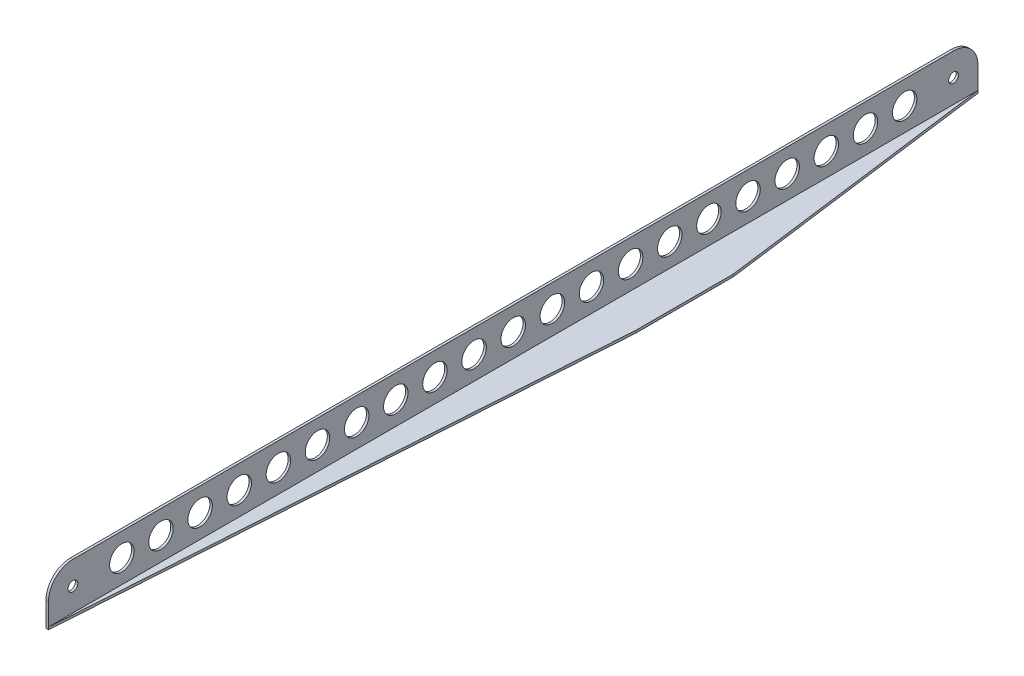
ISO-10303-21;
HEADER;
FILE_DESCRIPTION(('STEP AP214'),'2;1');
FILE_NAME('part.step','',(''),(''),'','','');
FILE_SCHEMA(('AUTOMOTIVE_DESIGN { 1 0 10303 214 1 1 1 1 }'));
ENDSEC;
DATA;
#1=APPLICATION_CONTEXT('core data for automotive mechanical design processes');
#2=APPLICATION_PROTOCOL_DEFINITION('international standard','automotive_design',2000,#1);
#3=PRODUCT_CONTEXT('',#1,'mechanical');
#4=PRODUCT('Part','Part','',(#3));
#5=PRODUCT_RELATED_PRODUCT_CATEGORY('part','',(#4));
#6=PRODUCT_DEFINITION_FORMATION('','',#4);
#7=PRODUCT_DEFINITION_CONTEXT('part definition',#1,'design');
#8=PRODUCT_DEFINITION('design','',#6,#7);
#9=PRODUCT_DEFINITION_SHAPE('','',#8);
#10=(LENGTH_UNIT() NAMED_UNIT(*) SI_UNIT(.MILLI.,.METRE.));
#11=(NAMED_UNIT(*) PLANE_ANGLE_UNIT() SI_UNIT($,.RADIAN.));
#12=(NAMED_UNIT(*) SI_UNIT($,.STERADIAN.) SOLID_ANGLE_UNIT());
#13=UNCERTAINTY_MEASURE_WITH_UNIT(LENGTH_MEASURE(1.E-05),#10,'distance_accuracy_value','');
#14=(GEOMETRIC_REPRESENTATION_CONTEXT(3) GLOBAL_UNCERTAINTY_ASSIGNED_CONTEXT((#13)) GLOBAL_UNIT_ASSIGNED_CONTEXT((#10,
#11,#12)) REPRESENTATION_CONTEXT('',''));
#15=CARTESIAN_POINT('',(0.,0.,0.));
#16=DIRECTION('',(0.,0.,1.));
#17=DIRECTION('',(1.,0.,0.));
#18=AXIS2_PLACEMENT_3D('',#15,#16,#17);
#19=CARTESIAN_POINT('',(-9.,-24.8880108190066,30.));
#20=DIRECTION('',(1.,0.,0.));
#21=DIRECTION('',(0.,1.,0.));
#22=AXIS2_PLACEMENT_3D('',#19,#20,#21);
#23=CYLINDRICAL_SURFACE('',#22,4.99999999999999);
#24=CARTESIAN_POINT('',(1.,-24.8880108190066,30.));
#25=DIRECTION('',(1.,0.,0.));
#26=DIRECTION('',(0.,1.,0.));
#27=AXIS2_PLACEMENT_3D('',#24,#25,#26);
#28=CIRCLE('',#27,4.99999999999999);
#29=CARTESIAN_POINT('',(1.,-19.8880108190066,30.));
#30=VERTEX_POINT('',#29);
#31=EDGE_CURVE('E264',#30,#30,#28,.T.);
#32=ORIENTED_EDGE('',*,*,#31,.T.);
#33=EDGE_LOOP('',(#32));
#34=FACE_BOUND('',#33,.T.);
#35=CARTESIAN_POINT('',(0.,-24.8880108190066,30.));
#36=DIRECTION('',(1.,0.,0.));
#37=DIRECTION('',(0.,1.,0.));
#38=AXIS2_PLACEMENT_3D('',#35,#36,#37);
#39=CIRCLE('',#38,4.99999999999999);
#40=CARTESIAN_POINT('',(0.,-19.8880108190066,30.));
#41=VERTEX_POINT('',#40);
#42=EDGE_CURVE('E267',#41,#41,#39,.T.);
#43=ORIENTED_EDGE('',*,*,#42,.F.);
#44=EDGE_LOOP('',(#43));
#45=FACE_BOUND('',#44,.T.);
#46=ADVANCED_FACE('F33',(#34,#45),#23,.F.);
#47=CARTESIAN_POINT('',(-9.,-24.8880108190066,46.));
#48=DIRECTION('',(1.,0.,0.));
#49=DIRECTION('',(0.,1.,0.));
#50=AXIS2_PLACEMENT_3D('',#47,#48,#49);
#51=CYLINDRICAL_SURFACE('',#50,4.99999999999999);
#52=CARTESIAN_POINT('',(1.,-24.8880108190066,46.));
#53=DIRECTION('',(1.,0.,0.));
#54=DIRECTION('',(0.,1.,0.));
#55=AXIS2_PLACEMENT_3D('',#52,#53,#54);
#56=CIRCLE('',#55,4.99999999999999);
#57=CARTESIAN_POINT('',(1.,-19.8880108190066,46.));
#58=VERTEX_POINT('',#57);
#59=EDGE_CURVE('E258',#58,#58,#56,.T.);
#60=ORIENTED_EDGE('',*,*,#59,.T.);
#61=EDGE_LOOP('',(#60));
#62=FACE_BOUND('',#61,.T.);
#63=CARTESIAN_POINT('',(0.,-24.8880108190066,46.));
#64=DIRECTION('',(1.,0.,0.));
#65=DIRECTION('',(0.,1.,0.));
#66=AXIS2_PLACEMENT_3D('',#63,#64,#65);
#67=CIRCLE('',#66,4.99999999999999);
#68=CARTESIAN_POINT('',(0.,-19.8880108190066,46.));
#69=VERTEX_POINT('',#68);
#70=EDGE_CURVE('E261',#69,#69,#67,.T.);
#71=ORIENTED_EDGE('',*,*,#70,.F.);
#72=EDGE_LOOP('',(#71));
#73=FACE_BOUND('',#72,.T.);
#74=ADVANCED_FACE('F367',(#62,#73),#51,.F.);
#75=CARTESIAN_POINT('',(-9.,-24.8880108190066,61.9999999999999));
#76=DIRECTION('',(1.,0.,0.));
#77=DIRECTION('',(0.,1.,0.));
#78=AXIS2_PLACEMENT_3D('',#75,#76,#77);
#79=CYLINDRICAL_SURFACE('',#78,4.99999999999999);
#80=CARTESIAN_POINT('',(1.,-24.8880108190066,61.9999999999999));
#81=DIRECTION('',(1.,0.,0.));
#82=DIRECTION('',(0.,1.,0.));
#83=AXIS2_PLACEMENT_3D('',#80,#81,#82);
#84=CIRCLE('',#83,4.99999999999999);
#85=CARTESIAN_POINT('',(1.,-19.8880108190066,61.9999999999999));
#86=VERTEX_POINT('',#85);
#87=EDGE_CURVE('E252',#86,#86,#84,.T.);
#88=ORIENTED_EDGE('',*,*,#87,.T.);
#89=EDGE_LOOP('',(#88));
#90=FACE_BOUND('',#89,.T.);
#91=CARTESIAN_POINT('',(0.,-24.8880108190066,61.9999999999999));
#92=DIRECTION('',(1.,0.,0.));
#93=DIRECTION('',(0.,1.,0.));
#94=AXIS2_PLACEMENT_3D('',#91,#92,#93);
#95=CIRCLE('',#94,4.99999999999999);
#96=CARTESIAN_POINT('',(0.,-19.8880108190066,61.9999999999999));
#97=VERTEX_POINT('',#96);
#98=EDGE_CURVE('E255',#97,#97,#95,.T.);
#99=ORIENTED_EDGE('',*,*,#98,.F.);
#100=EDGE_LOOP('',(#99));
#101=FACE_BOUND('',#100,.T.);
#102=ADVANCED_FACE('F374',(#90,#101),#79,.F.);
#103=CARTESIAN_POINT('',(-9.,-24.8880108190066,78.));
#104=DIRECTION('',(1.,0.,0.));
#105=DIRECTION('',(0.,1.,0.));
#106=AXIS2_PLACEMENT_3D('',#103,#104,#105);
#107=CYLINDRICAL_SURFACE('',#106,4.99999999999999);
#108=CARTESIAN_POINT('',(1.,-24.8880108190066,78.));
#109=DIRECTION('',(1.,0.,0.));
#110=DIRECTION('',(0.,1.,0.));
#111=AXIS2_PLACEMENT_3D('',#108,#109,#110);
#112=CIRCLE('',#111,4.99999999999999);
#113=CARTESIAN_POINT('',(1.,-19.8880108190066,78.));
#114=VERTEX_POINT('',#113);
#115=EDGE_CURVE('E246',#114,#114,#112,.T.);
#116=ORIENTED_EDGE('',*,*,#115,.T.);
#117=EDGE_LOOP('',(#116));
#118=FACE_BOUND('',#117,.T.);
#119=CARTESIAN_POINT('',(0.,-24.8880108190066,78.));
#120=DIRECTION('',(1.,0.,0.));
#121=DIRECTION('',(0.,1.,0.));
#122=AXIS2_PLACEMENT_3D('',#119,#120,#121);
#123=CIRCLE('',#122,4.99999999999999);
#124=CARTESIAN_POINT('',(0.,-19.8880108190066,78.));
#125=VERTEX_POINT('',#124);
#126=EDGE_CURVE('E249',#125,#125,#123,.T.);
#127=ORIENTED_EDGE('',*,*,#126,.F.);
#128=EDGE_LOOP('',(#127));
#129=FACE_BOUND('',#128,.T.);
#130=ADVANCED_FACE('F460',(#118,#129),#107,.F.);
#131=CARTESIAN_POINT('',(-9.,-24.8880108190066,94.));
#132=DIRECTION('',(1.,0.,0.));
#133=DIRECTION('',(0.,1.,0.));
#134=AXIS2_PLACEMENT_3D('',#131,#132,#133);
#135=CYLINDRICAL_SURFACE('',#134,4.99999999999999);
#136=CARTESIAN_POINT('',(1.,-24.8880108190066,94.));
#137=DIRECTION('',(1.,0.,0.));
#138=DIRECTION('',(0.,1.,0.));
#139=AXIS2_PLACEMENT_3D('',#136,#137,#138);
#140=CIRCLE('',#139,4.99999999999999);
#141=CARTESIAN_POINT('',(1.,-19.8880108190066,94.));
#142=VERTEX_POINT('',#141);
#143=EDGE_CURVE('E240',#142,#142,#140,.T.);
#144=ORIENTED_EDGE('',*,*,#143,.T.);
#145=EDGE_LOOP('',(#144));
#146=FACE_BOUND('',#145,.T.);
#147=CARTESIAN_POINT('',(0.,-24.8880108190066,94.));
#148=DIRECTION('',(1.,0.,0.));
#149=DIRECTION('',(0.,1.,0.));
#150=AXIS2_PLACEMENT_3D('',#147,#148,#149);
#151=CIRCLE('',#150,4.99999999999999);
#152=CARTESIAN_POINT('',(0.,-19.8880108190066,94.));
#153=VERTEX_POINT('',#152);
#154=EDGE_CURVE('E243',#153,#153,#151,.T.);
#155=ORIENTED_EDGE('',*,*,#154,.F.);
#156=EDGE_LOOP('',(#155));
#157=FACE_BOUND('',#156,.T.);
#158=ADVANCED_FACE('F469',(#146,#157),#135,.F.);
#159=CARTESIAN_POINT('',(-9.,-24.8880108190066,110.));
#160=DIRECTION('',(1.,0.,0.));
#161=DIRECTION('',(0.,1.,0.));
#162=AXIS2_PLACEMENT_3D('',#159,#160,#161);
#163=CYLINDRICAL_SURFACE('',#162,4.99999999999999);
#164=CARTESIAN_POINT('',(1.,-24.8880108190066,110.));
#165=DIRECTION('',(1.,0.,0.));
#166=DIRECTION('',(0.,1.,0.));
#167=AXIS2_PLACEMENT_3D('',#164,#165,#166);
#168=CIRCLE('',#167,4.99999999999999);
#169=CARTESIAN_POINT('',(1.,-19.8880108190066,110.));
#170=VERTEX_POINT('',#169);
#171=EDGE_CURVE('E234',#170,#170,#168,.T.);
#172=ORIENTED_EDGE('',*,*,#171,.T.);
#173=EDGE_LOOP('',(#172));
#174=FACE_BOUND('',#173,.T.);
#175=CARTESIAN_POINT('',(0.,-24.8880108190066,110.));
#176=DIRECTION('',(1.,0.,0.));
#177=DIRECTION('',(0.,1.,0.));
#178=AXIS2_PLACEMENT_3D('',#175,#176,#177);
#179=CIRCLE('',#178,4.99999999999999);
#180=CARTESIAN_POINT('',(0.,-19.8880108190066,110.));
#181=VERTEX_POINT('',#180);
#182=EDGE_CURVE('E237',#181,#181,#179,.T.);
#183=ORIENTED_EDGE('',*,*,#182,.F.);
#184=EDGE_LOOP('',(#183));
#185=FACE_BOUND('',#184,.T.);
#186=ADVANCED_FACE('F479',(#174,#185),#163,.F.);
#187=CARTESIAN_POINT('',(-9.,-24.8880108190066,126.));
#188=DIRECTION('',(1.,0.,0.));
#189=DIRECTION('',(0.,1.,0.));
#190=AXIS2_PLACEMENT_3D('',#187,#188,#189);
#191=CYLINDRICAL_SURFACE('',#190,4.99999999999999);
#192=CARTESIAN_POINT('',(1.,-24.8880108190066,126.));
#193=DIRECTION('',(1.,0.,0.));
#194=DIRECTION('',(0.,1.,0.));
#195=AXIS2_PLACEMENT_3D('',#192,#193,#194);
#196=CIRCLE('',#195,4.99999999999999);
#197=CARTESIAN_POINT('',(1.,-19.8880108190066,126.));
#198=VERTEX_POINT('',#197);
#199=EDGE_CURVE('E228',#198,#198,#196,.T.);
#200=ORIENTED_EDGE('',*,*,#199,.T.);
#201=EDGE_LOOP('',(#200));
#202=FACE_BOUND('',#201,.T.);
#203=CARTESIAN_POINT('',(0.,-24.8880108190066,126.));
#204=DIRECTION('',(1.,0.,0.));
#205=DIRECTION('',(0.,1.,0.));
#206=AXIS2_PLACEMENT_3D('',#203,#204,#205);
#207=CIRCLE('',#206,4.99999999999999);
#208=CARTESIAN_POINT('',(0.,-19.8880108190066,126.));
#209=VERTEX_POINT('',#208);
#210=EDGE_CURVE('E231',#209,#209,#207,.T.);
#211=ORIENTED_EDGE('',*,*,#210,.F.);
#212=EDGE_LOOP('',(#211));
#213=FACE_BOUND('',#212,.T.);
#214=ADVANCED_FACE('F489',(#202,#213),#191,.F.);
#215=CARTESIAN_POINT('',(-9.,-24.8880108190066,142.));
#216=DIRECTION('',(1.,0.,0.));
#217=DIRECTION('',(0.,1.,0.));
#218=AXIS2_PLACEMENT_3D('',#215,#216,#217);
#219=CYLINDRICAL_SURFACE('',#218,4.99999999999999);
#220=CARTESIAN_POINT('',(1.,-24.8880108190066,142.));
#221=DIRECTION('',(1.,0.,0.));
#222=DIRECTION('',(0.,1.,0.));
#223=AXIS2_PLACEMENT_3D('',#220,#221,#222);
#224=CIRCLE('',#223,4.99999999999999);
#225=CARTESIAN_POINT('',(1.,-19.8880108190066,142.));
#226=VERTEX_POINT('',#225);
#227=EDGE_CURVE('E222',#226,#226,#224,.T.);
#228=ORIENTED_EDGE('',*,*,#227,.T.);
#229=EDGE_LOOP('',(#228));
#230=FACE_BOUND('',#229,.T.);
#231=CARTESIAN_POINT('',(0.,-24.8880108190066,142.));
#232=DIRECTION('',(1.,0.,0.));
#233=DIRECTION('',(0.,1.,0.));
#234=AXIS2_PLACEMENT_3D('',#231,#232,#233);
#235=CIRCLE('',#234,4.99999999999999);
#236=CARTESIAN_POINT('',(0.,-19.8880108190066,142.));
#237=VERTEX_POINT('',#236);
#238=EDGE_CURVE('E225',#237,#237,#235,.T.);
#239=ORIENTED_EDGE('',*,*,#238,.F.);
#240=EDGE_LOOP('',(#239));
#241=FACE_BOUND('',#240,.T.);
#242=ADVANCED_FACE('F499',(#230,#241),#219,.F.);
#243=CARTESIAN_POINT('',(-9.,-24.8880108190066,158.));
#244=DIRECTION('',(1.,0.,0.));
#245=DIRECTION('',(0.,1.,0.));
#246=AXIS2_PLACEMENT_3D('',#243,#244,#245);
#247=CYLINDRICAL_SURFACE('',#246,4.99999999999999);
#248=CARTESIAN_POINT('',(1.,-24.8880108190066,158.));
#249=DIRECTION('',(1.,0.,0.));
#250=DIRECTION('',(0.,1.,0.));
#251=AXIS2_PLACEMENT_3D('',#248,#249,#250);
#252=CIRCLE('',#251,4.99999999999999);
#253=CARTESIAN_POINT('',(1.,-19.8880108190066,158.));
#254=VERTEX_POINT('',#253);
#255=EDGE_CURVE('E216',#254,#254,#252,.T.);
#256=ORIENTED_EDGE('',*,*,#255,.T.);
#257=EDGE_LOOP('',(#256));
#258=FACE_BOUND('',#257,.T.);
#259=CARTESIAN_POINT('',(0.,-24.8880108190066,158.));
#260=DIRECTION('',(1.,0.,0.));
#261=DIRECTION('',(0.,1.,0.));
#262=AXIS2_PLACEMENT_3D('',#259,#260,#261);
#263=CIRCLE('',#262,4.99999999999999);
#264=CARTESIAN_POINT('',(0.,-19.8880108190066,158.));
#265=VERTEX_POINT('',#264);
#266=EDGE_CURVE('E219',#265,#265,#263,.T.);
#267=ORIENTED_EDGE('',*,*,#266,.F.);
#268=EDGE_LOOP('',(#267));
#269=FACE_BOUND('',#268,.T.);
#270=ADVANCED_FACE('F509',(#258,#269),#247,.F.);
#271=CARTESIAN_POINT('',(-9.,-24.8880108190066,174.));
#272=DIRECTION('',(1.,0.,0.));
#273=DIRECTION('',(0.,1.,0.));
#274=AXIS2_PLACEMENT_3D('',#271,#272,#273);
#275=CYLINDRICAL_SURFACE('',#274,4.99999999999999);
#276=CARTESIAN_POINT('',(1.,-24.8880108190066,174.));
#277=DIRECTION('',(1.,0.,0.));
#278=DIRECTION('',(0.,1.,0.));
#279=AXIS2_PLACEMENT_3D('',#276,#277,#278);
#280=CIRCLE('',#279,4.99999999999999);
#281=CARTESIAN_POINT('',(1.,-19.8880108190066,174.));
#282=VERTEX_POINT('',#281);
#283=EDGE_CURVE('E210',#282,#282,#280,.T.);
#284=ORIENTED_EDGE('',*,*,#283,.T.);
#285=EDGE_LOOP('',(#284));
#286=FACE_BOUND('',#285,.T.);
#287=CARTESIAN_POINT('',(0.,-24.8880108190066,174.));
#288=DIRECTION('',(1.,0.,0.));
#289=DIRECTION('',(0.,1.,0.));
#290=AXIS2_PLACEMENT_3D('',#287,#288,#289);
#291=CIRCLE('',#290,4.99999999999999);
#292=CARTESIAN_POINT('',(0.,-19.8880108190066,174.));
#293=VERTEX_POINT('',#292);
#294=EDGE_CURVE('E213',#293,#293,#291,.T.);
#295=ORIENTED_EDGE('',*,*,#294,.F.);
#296=EDGE_LOOP('',(#295));
#297=FACE_BOUND('',#296,.T.);
#298=ADVANCED_FACE('F519',(#286,#297),#275,.F.);
#299=CARTESIAN_POINT('',(-9.,-24.8880108190066,190.));
#300=DIRECTION('',(1.,0.,0.));
#301=DIRECTION('',(0.,1.,0.));
#302=AXIS2_PLACEMENT_3D('',#299,#300,#301);
#303=CYLINDRICAL_SURFACE('',#302,4.99999999999999);
#304=CARTESIAN_POINT('',(1.,-24.8880108190066,190.));
#305=DIRECTION('',(1.,0.,0.));
#306=DIRECTION('',(0.,1.,0.));
#307=AXIS2_PLACEMENT_3D('',#304,#305,#306);
#308=CIRCLE('',#307,4.99999999999999);
#309=CARTESIAN_POINT('',(1.,-19.8880108190066,190.));
#310=VERTEX_POINT('',#309);
#311=EDGE_CURVE('E204',#310,#310,#308,.T.);
#312=ORIENTED_EDGE('',*,*,#311,.T.);
#313=EDGE_LOOP('',(#312));
#314=FACE_BOUND('',#313,.T.);
#315=CARTESIAN_POINT('',(0.,-24.8880108190066,190.));
#316=DIRECTION('',(1.,0.,0.));
#317=DIRECTION('',(0.,1.,0.));
#318=AXIS2_PLACEMENT_3D('',#315,#316,#317);
#319=CIRCLE('',#318,4.99999999999999);
#320=CARTESIAN_POINT('',(0.,-19.8880108190066,190.));
#321=VERTEX_POINT('',#320);
#322=EDGE_CURVE('E207',#321,#321,#319,.T.);
#323=ORIENTED_EDGE('',*,*,#322,.F.);
#324=EDGE_LOOP('',(#323));
#325=FACE_BOUND('',#324,.T.);
#326=ADVANCED_FACE('F529',(#314,#325),#303,.F.);
#327=CARTESIAN_POINT('',(-9.,-24.8880108190066,206.));
#328=DIRECTION('',(1.,0.,0.));
#329=DIRECTION('',(0.,1.,0.));
#330=AXIS2_PLACEMENT_3D('',#327,#328,#329);
#331=CYLINDRICAL_SURFACE('',#330,4.99999999999999);
#332=CARTESIAN_POINT('',(1.,-24.8880108190066,206.));
#333=DIRECTION('',(1.,0.,0.));
#334=DIRECTION('',(0.,1.,0.));
#335=AXIS2_PLACEMENT_3D('',#332,#333,#334);
#336=CIRCLE('',#335,4.99999999999999);
#337=CARTESIAN_POINT('',(1.,-19.8880108190066,206.));
#338=VERTEX_POINT('',#337);
#339=EDGE_CURVE('E198',#338,#338,#336,.T.);
#340=ORIENTED_EDGE('',*,*,#339,.T.);
#341=EDGE_LOOP('',(#340));
#342=FACE_BOUND('',#341,.T.);
#343=CARTESIAN_POINT('',(0.,-24.8880108190066,206.));
#344=DIRECTION('',(1.,0.,0.));
#345=DIRECTION('',(0.,1.,0.));
#346=AXIS2_PLACEMENT_3D('',#343,#344,#345);
#347=CIRCLE('',#346,4.99999999999999);
#348=CARTESIAN_POINT('',(0.,-19.8880108190066,206.));
#349=VERTEX_POINT('',#348);
#350=EDGE_CURVE('E201',#349,#349,#347,.T.);
#351=ORIENTED_EDGE('',*,*,#350,.F.);
#352=EDGE_LOOP('',(#351));
#353=FACE_BOUND('',#352,.T.);
#354=ADVANCED_FACE('F539',(#342,#353),#331,.F.);
#355=CARTESIAN_POINT('',(-9.,-24.8880108190066,222.));
#356=DIRECTION('',(1.,0.,0.));
#357=DIRECTION('',(0.,1.,0.));
#358=AXIS2_PLACEMENT_3D('',#355,#356,#357);
#359=CYLINDRICAL_SURFACE('',#358,4.99999999999999);
#360=CARTESIAN_POINT('',(1.,-24.8880108190066,222.));
#361=DIRECTION('',(1.,0.,0.));
#362=DIRECTION('',(0.,1.,0.));
#363=AXIS2_PLACEMENT_3D('',#360,#361,#362);
#364=CIRCLE('',#363,4.99999999999999);
#365=CARTESIAN_POINT('',(1.,-19.8880108190066,222.));
#366=VERTEX_POINT('',#365);
#367=EDGE_CURVE('E192',#366,#366,#364,.T.);
#368=ORIENTED_EDGE('',*,*,#367,.T.);
#369=EDGE_LOOP('',(#368));
#370=FACE_BOUND('',#369,.T.);
#371=CARTESIAN_POINT('',(0.,-24.8880108190066,222.));
#372=DIRECTION('',(1.,0.,0.));
#373=DIRECTION('',(0.,1.,0.));
#374=AXIS2_PLACEMENT_3D('',#371,#372,#373);
#375=CIRCLE('',#374,4.99999999999999);
#376=CARTESIAN_POINT('',(0.,-19.8880108190066,222.));
#377=VERTEX_POINT('',#376);
#378=EDGE_CURVE('E195',#377,#377,#375,.T.);
#379=ORIENTED_EDGE('',*,*,#378,.F.);
#380=EDGE_LOOP('',(#379));
#381=FACE_BOUND('',#380,.T.);
#382=ADVANCED_FACE('F549',(#370,#381),#359,.F.);
#383=CARTESIAN_POINT('',(-9.,-24.8880108190066,238.));
#384=DIRECTION('',(1.,0.,0.));
#385=DIRECTION('',(0.,1.,0.));
#386=AXIS2_PLACEMENT_3D('',#383,#384,#385);
#387=CYLINDRICAL_SURFACE('',#386,4.99999999999999);
#388=CARTESIAN_POINT('',(1.,-24.8880108190066,238.));
#389=DIRECTION('',(1.,0.,0.));
#390=DIRECTION('',(0.,1.,0.));
#391=AXIS2_PLACEMENT_3D('',#388,#389,#390);
#392=CIRCLE('',#391,4.99999999999999);
#393=CARTESIAN_POINT('',(1.,-19.8880108190066,238.));
#394=VERTEX_POINT('',#393);
#395=EDGE_CURVE('E186',#394,#394,#392,.T.);
#396=ORIENTED_EDGE('',*,*,#395,.T.);
#397=EDGE_LOOP('',(#396));
#398=FACE_BOUND('',#397,.T.);
#399=CARTESIAN_POINT('',(0.,-24.8880108190066,238.));
#400=DIRECTION('',(1.,0.,0.));
#401=DIRECTION('',(0.,1.,0.));
#402=AXIS2_PLACEMENT_3D('',#399,#400,#401);
#403=CIRCLE('',#402,4.99999999999999);
#404=CARTESIAN_POINT('',(0.,-19.8880108190066,238.));
#405=VERTEX_POINT('',#404);
#406=EDGE_CURVE('E189',#405,#405,#403,.T.);
#407=ORIENTED_EDGE('',*,*,#406,.F.);
#408=EDGE_LOOP('',(#407));
#409=FACE_BOUND('',#408,.T.);
#410=ADVANCED_FACE('F559',(#398,#409),#387,.F.);
#411=CARTESIAN_POINT('',(-9.,-24.8880108190066,254.));
#412=DIRECTION('',(1.,0.,0.));
#413=DIRECTION('',(0.,1.,0.));
#414=AXIS2_PLACEMENT_3D('',#411,#412,#413);
#415=CYLINDRICAL_SURFACE('',#414,4.99999999999999);
#416=CARTESIAN_POINT('',(1.,-24.8880108190066,254.));
#417=DIRECTION('',(1.,0.,0.));
#418=DIRECTION('',(0.,1.,0.));
#419=AXIS2_PLACEMENT_3D('',#416,#417,#418);
#420=CIRCLE('',#419,4.99999999999999);
#421=CARTESIAN_POINT('',(1.,-19.8880108190066,254.));
#422=VERTEX_POINT('',#421);
#423=EDGE_CURVE('E180',#422,#422,#420,.T.);
#424=ORIENTED_EDGE('',*,*,#423,.T.);
#425=EDGE_LOOP('',(#424));
#426=FACE_BOUND('',#425,.T.);
#427=CARTESIAN_POINT('',(0.,-24.8880108190066,254.));
#428=DIRECTION('',(1.,0.,0.));
#429=DIRECTION('',(0.,1.,0.));
#430=AXIS2_PLACEMENT_3D('',#427,#428,#429);
#431=CIRCLE('',#430,4.99999999999999);
#432=CARTESIAN_POINT('',(0.,-19.8880108190066,254.));
#433=VERTEX_POINT('',#432);
#434=EDGE_CURVE('E183',#433,#433,#431,.T.);
#435=ORIENTED_EDGE('',*,*,#434,.F.);
#436=EDGE_LOOP('',(#435));
#437=FACE_BOUND('',#436,.T.);
#438=ADVANCED_FACE('F569',(#426,#437),#415,.F.);
#439=CARTESIAN_POINT('',(-9.,-24.8880108190066,270.));
#440=DIRECTION('',(1.,0.,0.));
#441=DIRECTION('',(0.,1.,0.));
#442=AXIS2_PLACEMENT_3D('',#439,#440,#441);
#443=CYLINDRICAL_SURFACE('',#442,4.99999999999999);
#444=CARTESIAN_POINT('',(1.,-24.8880108190066,270.));
#445=DIRECTION('',(1.,0.,0.));
#446=DIRECTION('',(0.,1.,0.));
#447=AXIS2_PLACEMENT_3D('',#444,#445,#446);
#448=CIRCLE('',#447,4.99999999999999);
#449=CARTESIAN_POINT('',(1.,-19.8880108190066,270.));
#450=VERTEX_POINT('',#449);
#451=EDGE_CURVE('E174',#450,#450,#448,.T.);
#452=ORIENTED_EDGE('',*,*,#451,.T.);
#453=EDGE_LOOP('',(#452));
#454=FACE_BOUND('',#453,.T.);
#455=CARTESIAN_POINT('',(0.,-24.8880108190066,270.));
#456=DIRECTION('',(1.,0.,0.));
#457=DIRECTION('',(0.,1.,0.));
#458=AXIS2_PLACEMENT_3D('',#455,#456,#457);
#459=CIRCLE('',#458,4.99999999999999);
#460=CARTESIAN_POINT('',(0.,-19.8880108190066,270.));
#461=VERTEX_POINT('',#460);
#462=EDGE_CURVE('E177',#461,#461,#459,.T.);
#463=ORIENTED_EDGE('',*,*,#462,.F.);
#464=EDGE_LOOP('',(#463));
#465=FACE_BOUND('',#464,.T.);
#466=ADVANCED_FACE('F579',(#454,#465),#443,.F.);
#467=CARTESIAN_POINT('',(-9.,-24.8880108190066,286.));
#468=DIRECTION('',(1.,0.,0.));
#469=DIRECTION('',(0.,1.,0.));
#470=AXIS2_PLACEMENT_3D('',#467,#468,#469);
#471=CYLINDRICAL_SURFACE('',#470,4.99999999999999);
#472=CARTESIAN_POINT('',(1.,-24.8880108190066,286.));
#473=DIRECTION('',(1.,0.,0.));
#474=DIRECTION('',(0.,1.,0.));
#475=AXIS2_PLACEMENT_3D('',#472,#473,#474);
#476=CIRCLE('',#475,4.99999999999999);
#477=CARTESIAN_POINT('',(1.,-19.8880108190066,286.));
#478=VERTEX_POINT('',#477);
#479=EDGE_CURVE('E168',#478,#478,#476,.T.);
#480=ORIENTED_EDGE('',*,*,#479,.T.);
#481=EDGE_LOOP('',(#480));
#482=FACE_BOUND('',#481,.T.);
#483=CARTESIAN_POINT('',(0.,-24.8880108190066,286.));
#484=DIRECTION('',(1.,0.,0.));
#485=DIRECTION('',(0.,1.,0.));
#486=AXIS2_PLACEMENT_3D('',#483,#484,#485);
#487=CIRCLE('',#486,4.99999999999999);
#488=CARTESIAN_POINT('',(0.,-19.8880108190066,286.));
#489=VERTEX_POINT('',#488);
#490=EDGE_CURVE('E171',#489,#489,#487,.T.);
#491=ORIENTED_EDGE('',*,*,#490,.F.);
#492=EDGE_LOOP('',(#491));
#493=FACE_BOUND('',#492,.T.);
#494=ADVANCED_FACE('F589',(#482,#493),#471,.F.);
#495=CARTESIAN_POINT('',(-9.,-24.8880108190066,302.));
#496=DIRECTION('',(1.,0.,0.));
#497=DIRECTION('',(0.,1.,0.));
#498=AXIS2_PLACEMENT_3D('',#495,#496,#497);
#499=CYLINDRICAL_SURFACE('',#498,4.99999999999999);
#500=CARTESIAN_POINT('',(1.,-24.8880108190066,302.));
#501=DIRECTION('',(1.,0.,0.));
#502=DIRECTION('',(0.,1.,0.));
#503=AXIS2_PLACEMENT_3D('',#500,#501,#502);
#504=CIRCLE('',#503,4.99999999999999);
#505=CARTESIAN_POINT('',(1.,-19.8880108190066,302.));
#506=VERTEX_POINT('',#505);
#507=EDGE_CURVE('E162',#506,#506,#504,.T.);
#508=ORIENTED_EDGE('',*,*,#507,.T.);
#509=EDGE_LOOP('',(#508));
#510=FACE_BOUND('',#509,.T.);
#511=CARTESIAN_POINT('',(0.,-24.8880108190066,302.));
#512=DIRECTION('',(1.,0.,0.));
#513=DIRECTION('',(0.,1.,0.));
#514=AXIS2_PLACEMENT_3D('',#511,#512,#513);
#515=CIRCLE('',#514,4.99999999999999);
#516=CARTESIAN_POINT('',(0.,-19.8880108190066,302.));
#517=VERTEX_POINT('',#516);
#518=EDGE_CURVE('E165',#517,#517,#515,.T.);
#519=ORIENTED_EDGE('',*,*,#518,.F.);
#520=EDGE_LOOP('',(#519));
#521=FACE_BOUND('',#520,.T.);
#522=ADVANCED_FACE('F599',(#510,#521),#499,.F.);
#523=CARTESIAN_POINT('',(-9.,-24.8880108190066,318.));
#524=DIRECTION('',(1.,0.,0.));
#525=DIRECTION('',(0.,1.,0.));
#526=AXIS2_PLACEMENT_3D('',#523,#524,#525);
#527=CYLINDRICAL_SURFACE('',#526,4.99999999999999);
#528=CARTESIAN_POINT('',(1.,-24.8880108190066,318.));
#529=DIRECTION('',(1.,0.,0.));
#530=DIRECTION('',(0.,1.,0.));
#531=AXIS2_PLACEMENT_3D('',#528,#529,#530);
#532=CIRCLE('',#531,4.99999999999999);
#533=CARTESIAN_POINT('',(1.,-19.8880108190066,318.));
#534=VERTEX_POINT('',#533);
#535=EDGE_CURVE('E156',#534,#534,#532,.T.);
#536=ORIENTED_EDGE('',*,*,#535,.T.);
#537=EDGE_LOOP('',(#536));
#538=FACE_BOUND('',#537,.T.);
#539=CARTESIAN_POINT('',(0.,-24.8880108190066,318.));
#540=DIRECTION('',(1.,0.,0.));
#541=DIRECTION('',(0.,1.,0.));
#542=AXIS2_PLACEMENT_3D('',#539,#540,#541);
#543=CIRCLE('',#542,4.99999999999999);
#544=CARTESIAN_POINT('',(0.,-19.8880108190066,318.));
#545=VERTEX_POINT('',#544);
#546=EDGE_CURVE('E159',#545,#545,#543,.T.);
#547=ORIENTED_EDGE('',*,*,#546,.F.);
#548=EDGE_LOOP('',(#547));
#549=FACE_BOUND('',#548,.T.);
#550=ADVANCED_FACE('F363',(#538,#549),#527,.F.);
#551=CARTESIAN_POINT('',(1.,-15.3880108190066,380.));
#552=DIRECTION('',(0.,-1.,0.));
#553=DIRECTION('',(0.,0.,-1.));
#554=AXIS2_PLACEMENT_3D('',#551,#552,#553);
#555=PLANE('',#554);
#556=DIRECTION('',(0.,0.,-1.));
#557=VECTOR('',#556,1.);
#558=CARTESIAN_POINT('',(1.,-15.3880108190066,380.));
#559=LINE('',#558,#557);
#560=CARTESIAN_POINT('',(1.,-15.3880108190066,370.));
#561=VERTEX_POINT('',#560);
#562=CARTESIAN_POINT('',(1.,-15.3880108190066,10.));
#563=VERTEX_POINT('',#562);
#564=EDGE_CURVE('E137',#561,#563,#559,.T.);
#565=ORIENTED_EDGE('',*,*,#564,.T.);
#566=DIRECTION('',(-1.,0.,0.));
#567=VECTOR('',#566,1.);
#568=CARTESIAN_POINT('',(1.,-15.3880108190066,10.));
#569=LINE('',#568,#567);
#570=CARTESIAN_POINT('',(0.,-15.3880108190066,10.));
#571=VERTEX_POINT('',#570);
#572=EDGE_CURVE('E272',#563,#571,#569,.T.);
#573=ORIENTED_EDGE('',*,*,#572,.T.);
#574=DIRECTION('',(0.,0.,-1.));
#575=VECTOR('',#574,1.);
#576=CARTESIAN_POINT('',(0.,-15.3880108190066,380.));
#577=LINE('',#576,#575);
#578=CARTESIAN_POINT('',(0.,-15.3880108190066,370.));
#579=VERTEX_POINT('',#578);
#580=EDGE_CURVE('E119',#579,#571,#577,.T.);
#581=ORIENTED_EDGE('',*,*,#580,.F.);
#582=DIRECTION('',(-1.,0.,0.));
#583=VECTOR('',#582,1.);
#584=CARTESIAN_POINT('',(1.,-15.3880108190066,370.));
#585=LINE('',#584,#583);
#586=EDGE_CURVE('E270',#579,#561,#585,.F.);
#587=ORIENTED_EDGE('',*,*,#586,.T.);
#588=EDGE_LOOP('',(#565,#573,#581,#587));
#589=FACE_BOUND('',#588,.T.);
#590=ADVANCED_FACE('F283',(#589),#555,.F.);
#591=CARTESIAN_POINT('',(0.,-15.3880108190066,380.));
#592=DIRECTION('',(1.,0.,0.));
#593=DIRECTION('',(0.,1.,0.));
#594=AXIS2_PLACEMENT_3D('',#591,#592,#593);
#595=PLANE('',#594);
#596=CARTESIAN_POINT('',(0.,-24.8880108190066,334.));
#597=DIRECTION('',(1.,0.,0.));
#598=DIRECTION('',(0.,1.,0.));
#599=AXIS2_PLACEMENT_3D('',#596,#597,#598);
#600=CIRCLE('',#599,4.99999999999999);
#601=CARTESIAN_POINT('',(0.,-19.8880108190066,334.));
#602=VERTEX_POINT('',#601);
#603=EDGE_CURVE('E326',#602,#602,#600,.T.);
#604=ORIENTED_EDGE('',*,*,#603,.T.);
#605=EDGE_LOOP('',(#604));
#606=FACE_BOUND('',#605,.T.);
#607=CARTESIAN_POINT('',(0.,-24.8880108190066,350.));
#608=DIRECTION('',(1.,0.,0.));
#609=DIRECTION('',(0.,1.,0.));
#610=AXIS2_PLACEMENT_3D('',#607,#608,#609);
#611=CIRCLE('',#610,4.99999999999999);
#612=CARTESIAN_POINT('',(0.,-19.8880108190066,350.));
#613=VERTEX_POINT('',#612);
#614=EDGE_CURVE('E129',#613,#613,#611,.T.);
#615=ORIENTED_EDGE('',*,*,#614,.T.);
#616=EDGE_LOOP('',(#615));
#617=FACE_BOUND('',#616,.T.);
#618=CARTESIAN_POINT('',(0.,-24.8880108190066,10.));
#619=DIRECTION('',(1.,0.,0.));
#620=DIRECTION('',(0.,1.,0.));
#621=AXIS2_PLACEMENT_3D('',#618,#619,#620);
#622=CIRCLE('',#621,2.);
#623=CARTESIAN_POINT('',(0.,-22.8880108190066,10.));
#624=VERTEX_POINT('',#623);
#625=EDGE_CURVE('E291',#624,#624,#622,.T.);
#626=ORIENTED_EDGE('',*,*,#625,.T.);
#627=EDGE_LOOP('',(#626));
#628=FACE_BOUND('',#627,.T.);
#629=CARTESIAN_POINT('',(0.,-24.8880108190066,370.));
#630=DIRECTION('',(1.,0.,0.));
#631=DIRECTION('',(0.,1.,0.));
#632=AXIS2_PLACEMENT_3D('',#629,#630,#631);
#633=CIRCLE('',#632,2.);
#634=CARTESIAN_POINT('',(0.,-22.8880108190066,370.));
#635=VERTEX_POINT('',#634);
#636=EDGE_CURVE('E293',#635,#635,#633,.T.);
#637=ORIENTED_EDGE('',*,*,#636,.T.);
#638=EDGE_LOOP('',(#637));
#639=FACE_BOUND('',#638,.T.);
#640=ORIENTED_EDGE('',*,*,#580,.T.);
#641=CARTESIAN_POINT('',(0.,-25.3880108190066,10.));
#642=DIRECTION('',(1.,0.,0.));
#643=DIRECTION('',(0.,1.,0.));
#644=AXIS2_PLACEMENT_3D('',#641,#642,#643);
#645=CIRCLE('',#644,10.);
#646=CARTESIAN_POINT('',(0.,-25.3880108190066,0.));
#647=VERTEX_POINT('',#646);
#648=EDGE_CURVE('E277',#571,#647,#645,.F.);
#649=ORIENTED_EDGE('',*,*,#648,.T.);
#650=DIRECTION('',(0.,-1.,0.));
#651=VECTOR('',#650,1.);
#652=CARTESIAN_POINT('',(0.,-15.3880108190066,0.));
#653=LINE('',#652,#651);
#654=CARTESIAN_POINT('',(0.,-35.3880108190066,0.));
#655=VERTEX_POINT('',#654);
#656=EDGE_CURVE('E145',#647,#655,#653,.T.);
#657=ORIENTED_EDGE('',*,*,#656,.T.);
#658=DIRECTION('',(0.,0.,-1.));
#659=VECTOR('',#658,1.);
#660=CARTESIAN_POINT('',(0.,-35.3880108190066,380.));
#661=LINE('',#660,#659);
#662=CARTESIAN_POINT('',(0.,-35.3880108190066,380.));
#663=VERTEX_POINT('',#662);
#664=EDGE_CURVE('E136',#663,#655,#661,.T.);
#665=ORIENTED_EDGE('',*,*,#664,.F.);
#666=DIRECTION('',(0.,-1.,0.));
#667=VECTOR('',#666,1.);
#668=CARTESIAN_POINT('',(0.,-15.3880108190066,380.));
#669=LINE('',#668,#667);
#670=CARTESIAN_POINT('',(0.,-25.3880108190066,380.));
#671=VERTEX_POINT('',#670);
#672=EDGE_CURVE('E140',#671,#663,#669,.T.);
#673=ORIENTED_EDGE('',*,*,#672,.F.);
#674=CARTESIAN_POINT('',(0.,-25.3880108190066,370.));
#675=DIRECTION('',(1.,0.,0.));
#676=DIRECTION('',(0.,1.,0.));
#677=AXIS2_PLACEMENT_3D('',#674,#675,#676);
#678=CIRCLE('',#677,10.);
#679=EDGE_CURVE('E275',#671,#579,#678,.F.);
#680=ORIENTED_EDGE('',*,*,#679,.T.);
#681=EDGE_LOOP('',(#640,#649,#657,#665,#673,#680));
#682=FACE_BOUND('',#681,.T.);
#683=ORIENTED_EDGE('',*,*,#546,.T.);
#684=EDGE_LOOP('',(#683));
#685=FACE_BOUND('',#684,.T.);
#686=ORIENTED_EDGE('',*,*,#518,.T.);
#687=EDGE_LOOP('',(#686));
#688=FACE_BOUND('',#687,.T.);
#689=ORIENTED_EDGE('',*,*,#490,.T.);
#690=EDGE_LOOP('',(#689));
#691=FACE_BOUND('',#690,.T.);
#692=ORIENTED_EDGE('',*,*,#462,.T.);
#693=EDGE_LOOP('',(#692));
#694=FACE_BOUND('',#693,.T.);
#695=ORIENTED_EDGE('',*,*,#434,.T.);
#696=EDGE_LOOP('',(#695));
#697=FACE_BOUND('',#696,.T.);
#698=ORIENTED_EDGE('',*,*,#406,.T.);
#699=EDGE_LOOP('',(#698));
#700=FACE_BOUND('',#699,.T.);
#701=ORIENTED_EDGE('',*,*,#378,.T.);
#702=EDGE_LOOP('',(#701));
#703=FACE_BOUND('',#702,.T.);
#704=ORIENTED_EDGE('',*,*,#350,.T.);
#705=EDGE_LOOP('',(#704));
#706=FACE_BOUND('',#705,.T.);
#707=ORIENTED_EDGE('',*,*,#322,.T.);
#708=EDGE_LOOP('',(#707));
#709=FACE_BOUND('',#708,.T.);
#710=ORIENTED_EDGE('',*,*,#294,.T.);
#711=EDGE_LOOP('',(#710));
#712=FACE_BOUND('',#711,.T.);
#713=ORIENTED_EDGE('',*,*,#266,.T.);
#714=EDGE_LOOP('',(#713));
#715=FACE_BOUND('',#714,.T.);
#716=ORIENTED_EDGE('',*,*,#238,.T.);
#717=EDGE_LOOP('',(#716));
#718=FACE_BOUND('',#717,.T.);
#719=ORIENTED_EDGE('',*,*,#210,.T.);
#720=EDGE_LOOP('',(#719));
#721=FACE_BOUND('',#720,.T.);
#722=ORIENTED_EDGE('',*,*,#182,.T.);
#723=EDGE_LOOP('',(#722));
#724=FACE_BOUND('',#723,.T.);
#725=ORIENTED_EDGE('',*,*,#154,.T.);
#726=EDGE_LOOP('',(#725));
#727=FACE_BOUND('',#726,.T.);
#728=ORIENTED_EDGE('',*,*,#126,.T.);
#729=EDGE_LOOP('',(#728));
#730=FACE_BOUND('',#729,.T.);
#731=ORIENTED_EDGE('',*,*,#98,.T.);
#732=EDGE_LOOP('',(#731));
#733=FACE_BOUND('',#732,.T.);
#734=ORIENTED_EDGE('',*,*,#70,.T.);
#735=EDGE_LOOP('',(#734));
#736=FACE_BOUND('',#735,.T.);
#737=ORIENTED_EDGE('',*,*,#42,.T.);
#738=EDGE_LOOP('',(#737));
#739=FACE_BOUND('',#738,.T.);
#740=ADVANCED_FACE('F288',(#606,#617,#628,#639,#682,#685,#688,#691,#694,#697,#700,#703,#706,
#709,#712,#715,#718,#721,#724,#727,#730,#733,#736,#739),#595,.F.);
#741=CARTESIAN_POINT('',(0.,-35.3880108190066,380.));
#742=DIRECTION('',(0.,1.,0.));
#743=DIRECTION('',(0.,0.,1.));
#744=AXIS2_PLACEMENT_3D('',#741,#742,#743);
#745=PLANE('',#744);
#746=DIRECTION('',(0.,0.,1.));
#747=VECTOR('',#746,1.);
#748=CARTESIAN_POINT('',(16.,-35.3880108190066,380.));
#749=LINE('',#748,#747);
#750=CARTESIAN_POINT('',(16.,-35.3880108190066,115.));
#751=VERTEX_POINT('',#750);
#752=CARTESIAN_POINT('',(16.,-35.3880108190066,155.));
#753=VERTEX_POINT('',#752);
#754=EDGE_CURVE('E305',#751,#753,#749,.T.);
#755=ORIENTED_EDGE('',*,*,#754,.T.);
#756=DIRECTION('',(-0.066519010523774,0.,0.997785157856609));
#757=VECTOR('',#756,1.);
#758=CARTESIAN_POINT('',(0.995575221238938,-35.3880108190066,380.066371681416));
#759=LINE('',#758,#757);
#760=CARTESIAN_POINT('',(1.,-35.3880108190066,380.));
#761=VERTEX_POINT('',#760);
#762=EDGE_CURVE('E310',#753,#761,#759,.T.);
#763=ORIENTED_EDGE('',*,*,#762,.T.);
#764=DIRECTION('',(1.,0.,0.));
#765=VECTOR('',#764,1.);
#766=CARTESIAN_POINT('',(0.,-35.3880108190066,380.));
#767=LINE('',#766,#765);
#768=EDGE_CURVE('E143',#663,#761,#767,.T.);
#769=ORIENTED_EDGE('',*,*,#768,.F.);
#770=ORIENTED_EDGE('',*,*,#664,.T.);
#771=DIRECTION('',(1.,0.,0.));
#772=VECTOR('',#771,1.);
#773=CARTESIAN_POINT('',(0.,-35.3880108190066,0.));
#774=LINE('',#773,#772);
#775=CARTESIAN_POINT('',(1.,-35.3880108190066,0.));
#776=VERTEX_POINT('',#775);
#777=EDGE_CURVE('E141',#655,#776,#774,.T.);
#778=ORIENTED_EDGE('',*,*,#777,.T.);
#779=DIRECTION('',(0.129339184067768,0.,0.991600411186222));
#780=VECTOR('',#779,1.);
#781=CARTESIAN_POINT('',(49.7193308550186,-35.3880108190066,373.514869888476));
#782=LINE('',#781,#780);
#783=EDGE_CURVE('E115',#776,#751,#782,.T.);
#784=ORIENTED_EDGE('',*,*,#783,.T.);
#785=EDGE_LOOP('',(#755,#763,#769,#770,#778,#784));
#786=FACE_BOUND('',#785,.T.);
#787=ADVANCED_FACE('F354',(#786),#745,.F.);
#788=CARTESIAN_POINT('',(20.,-34.3880108190066,380.));
#789=DIRECTION('',(0.,-1.,0.));
#790=DIRECTION('',(0.,0.,-1.));
#791=AXIS2_PLACEMENT_3D('',#788,#789,#790);
#792=PLANE('',#791);
#793=DIRECTION('',(0.,0.,-1.));
#794=VECTOR('',#793,1.);
#795=CARTESIAN_POINT('',(1.,-34.3880108190066,380.));
#796=LINE('',#795,#794);
#797=CARTESIAN_POINT('',(1.,-34.3880108190066,380.));
#798=VERTEX_POINT('',#797);
#799=CARTESIAN_POINT('',(1.,-34.3880108190066,0.));
#800=VERTEX_POINT('',#799);
#801=EDGE_CURVE('E126',#798,#800,#796,.T.);
#802=ORIENTED_EDGE('',*,*,#801,.F.);
#803=DIRECTION('',(-0.066519010523774,0.,0.997785157856609));
#804=VECTOR('',#803,1.);
#805=CARTESIAN_POINT('',(16.,-34.3880108190066,155.));
#806=LINE('',#805,#804);
#807=CARTESIAN_POINT('',(16.,-34.3880108190066,155.));
#808=VERTEX_POINT('',#807);
#809=EDGE_CURVE('E317',#808,#798,#806,.T.);
#810=ORIENTED_EDGE('',*,*,#809,.F.);
#811=DIRECTION('',(0.,0.,1.));
#812=VECTOR('',#811,1.);
#813=CARTESIAN_POINT('',(16.,-34.3880108190066,115.));
#814=LINE('',#813,#812);
#815=CARTESIAN_POINT('',(16.,-34.3880108190066,115.));
#816=VERTEX_POINT('',#815);
#817=EDGE_CURVE('E128',#816,#808,#814,.T.);
#818=ORIENTED_EDGE('',*,*,#817,.F.);
#819=DIRECTION('',(0.129339184067768,0.,0.991600411186222));
#820=VECTOR('',#819,1.);
#821=CARTESIAN_POINT('',(1.,-34.3880108190066,0.));
#822=LINE('',#821,#820);
#823=EDGE_CURVE('E112',#800,#816,#822,.T.);
#824=ORIENTED_EDGE('',*,*,#823,.F.);
#825=EDGE_LOOP('',(#802,#810,#818,#824));
#826=FACE_BOUND('',#825,.T.);
#827=ADVANCED_FACE('F124',(#826),#792,.F.);
#828=CARTESIAN_POINT('',(1.,-34.3880108190066,380.));
#829=DIRECTION('',(-1.,0.,0.));
#830=DIRECTION('',(0.,-1.,0.));
#831=AXIS2_PLACEMENT_3D('',#828,#829,#830);
#832=PLANE('',#831);
#833=CARTESIAN_POINT('',(1.,-24.8880108190066,334.));
#834=DIRECTION('',(1.,0.,0.));
#835=DIRECTION('',(0.,1.,0.));
#836=AXIS2_PLACEMENT_3D('',#833,#834,#835);
#837=CIRCLE('',#836,4.99999999999999);
#838=CARTESIAN_POINT('',(1.,-19.8880108190066,334.));
#839=VERTEX_POINT('',#838);
#840=EDGE_CURVE('E329',#839,#839,#837,.T.);
#841=ORIENTED_EDGE('',*,*,#840,.F.);
#842=EDGE_LOOP('',(#841));
#843=FACE_BOUND('',#842,.T.);
#844=CARTESIAN_POINT('',(1.,-24.8880108190066,350.));
#845=DIRECTION('',(1.,0.,0.));
#846=DIRECTION('',(0.,1.,0.));
#847=AXIS2_PLACEMENT_3D('',#844,#845,#846);
#848=CIRCLE('',#847,4.99999999999999);
#849=CARTESIAN_POINT('',(1.,-19.8880108190066,350.));
#850=VERTEX_POINT('',#849);
#851=EDGE_CURVE('E323',#850,#850,#848,.T.);
#852=ORIENTED_EDGE('',*,*,#851,.F.);
#853=EDGE_LOOP('',(#852));
#854=FACE_BOUND('',#853,.T.);
#855=CARTESIAN_POINT('',(1.,-24.8880108190066,10.));
#856=DIRECTION('',(1.,0.,0.));
#857=DIRECTION('',(0.,1.,0.));
#858=AXIS2_PLACEMENT_3D('',#855,#856,#857);
#859=CIRCLE('',#858,2.);
#860=CARTESIAN_POINT('',(1.,-22.8880108190066,10.));
#861=VERTEX_POINT('',#860);
#862=EDGE_CURVE('E301',#861,#861,#859,.T.);
#863=ORIENTED_EDGE('',*,*,#862,.F.);
#864=EDGE_LOOP('',(#863));
#865=FACE_BOUND('',#864,.T.);
#866=CARTESIAN_POINT('',(1.,-24.8880108190066,370.));
#867=DIRECTION('',(1.,0.,0.));
#868=DIRECTION('',(0.,1.,0.));
#869=AXIS2_PLACEMENT_3D('',#866,#867,#868);
#870=CIRCLE('',#869,2.);
#871=CARTESIAN_POINT('',(1.,-22.8880108190066,370.));
#872=VERTEX_POINT('',#871);
#873=EDGE_CURVE('E302',#872,#872,#870,.T.);
#874=ORIENTED_EDGE('',*,*,#873,.F.);
#875=EDGE_LOOP('',(#874));
#876=FACE_BOUND('',#875,.T.);
#877=DIRECTION('',(0.,1.,0.));
#878=VECTOR('',#877,1.);
#879=CARTESIAN_POINT('',(1.,-34.3880108190066,0.));
#880=LINE('',#879,#878);
#881=CARTESIAN_POINT('',(1.,-25.3880108190066,0.));
#882=VERTEX_POINT('',#881);
#883=EDGE_CURVE('E133',#800,#882,#880,.T.);
#884=ORIENTED_EDGE('',*,*,#883,.T.);
#885=CARTESIAN_POINT('',(1.,-25.3880108190066,10.));
#886=DIRECTION('',(-1.,0.,0.));
#887=DIRECTION('',(0.,-1.,0.));
#888=AXIS2_PLACEMENT_3D('',#885,#886,#887);
#889=CIRCLE('',#888,10.);
#890=EDGE_CURVE('E41',#882,#563,#889,.F.);
#891=ORIENTED_EDGE('',*,*,#890,.T.);
#892=ORIENTED_EDGE('',*,*,#564,.F.);
#893=CARTESIAN_POINT('',(1.,-25.3880108190066,370.));
#894=DIRECTION('',(-1.,0.,0.));
#895=DIRECTION('',(0.,-1.,0.));
#896=AXIS2_PLACEMENT_3D('',#893,#894,#895);
#897=CIRCLE('',#896,10.);
#898=CARTESIAN_POINT('',(1.,-25.3880108190066,380.));
#899=VERTEX_POINT('',#898);
#900=EDGE_CURVE('E48',#561,#899,#897,.F.);
#901=ORIENTED_EDGE('',*,*,#900,.T.);
#902=DIRECTION('',(0.,1.,0.));
#903=VECTOR('',#902,1.);
#904=CARTESIAN_POINT('',(1.,-34.3880108190066,380.));
#905=LINE('',#904,#903);
#906=EDGE_CURVE('E135',#798,#899,#905,.T.);
#907=ORIENTED_EDGE('',*,*,#906,.F.);
#908=ORIENTED_EDGE('',*,*,#801,.T.);
#909=EDGE_LOOP('',(#884,#891,#892,#901,#907,#908));
#910=FACE_BOUND('',#909,.T.);
#911=ORIENTED_EDGE('',*,*,#535,.F.);
#912=EDGE_LOOP('',(#911));
#913=FACE_BOUND('',#912,.T.);
#914=ORIENTED_EDGE('',*,*,#507,.F.);
#915=EDGE_LOOP('',(#914));
#916=FACE_BOUND('',#915,.T.);
#917=ORIENTED_EDGE('',*,*,#479,.F.);
#918=EDGE_LOOP('',(#917));
#919=FACE_BOUND('',#918,.T.);
#920=ORIENTED_EDGE('',*,*,#451,.F.);
#921=EDGE_LOOP('',(#920));
#922=FACE_BOUND('',#921,.T.);
#923=ORIENTED_EDGE('',*,*,#423,.F.);
#924=EDGE_LOOP('',(#923));
#925=FACE_BOUND('',#924,.T.);
#926=ORIENTED_EDGE('',*,*,#395,.F.);
#927=EDGE_LOOP('',(#926));
#928=FACE_BOUND('',#927,.T.);
#929=ORIENTED_EDGE('',*,*,#367,.F.);
#930=EDGE_LOOP('',(#929));
#931=FACE_BOUND('',#930,.T.);
#932=ORIENTED_EDGE('',*,*,#339,.F.);
#933=EDGE_LOOP('',(#932));
#934=FACE_BOUND('',#933,.T.);
#935=ORIENTED_EDGE('',*,*,#311,.F.);
#936=EDGE_LOOP('',(#935));
#937=FACE_BOUND('',#936,.T.);
#938=ORIENTED_EDGE('',*,*,#283,.F.);
#939=EDGE_LOOP('',(#938));
#940=FACE_BOUND('',#939,.T.);
#941=ORIENTED_EDGE('',*,*,#255,.F.);
#942=EDGE_LOOP('',(#941));
#943=FACE_BOUND('',#942,.T.);
#944=ORIENTED_EDGE('',*,*,#227,.F.);
#945=EDGE_LOOP('',(#944));
#946=FACE_BOUND('',#945,.T.);
#947=ORIENTED_EDGE('',*,*,#199,.F.);
#948=EDGE_LOOP('',(#947));
#949=FACE_BOUND('',#948,.T.);
#950=ORIENTED_EDGE('',*,*,#171,.F.);
#951=EDGE_LOOP('',(#950));
#952=FACE_BOUND('',#951,.T.);
#953=ORIENTED_EDGE('',*,*,#143,.F.);
#954=EDGE_LOOP('',(#953));
#955=FACE_BOUND('',#954,.T.);
#956=ORIENTED_EDGE('',*,*,#115,.F.);
#957=EDGE_LOOP('',(#956));
#958=FACE_BOUND('',#957,.T.);
#959=ORIENTED_EDGE('',*,*,#87,.F.);
#960=EDGE_LOOP('',(#959));
#961=FACE_BOUND('',#960,.T.);
#962=ORIENTED_EDGE('',*,*,#59,.F.);
#963=EDGE_LOOP('',(#962));
#964=FACE_BOUND('',#963,.T.);
#965=ORIENTED_EDGE('',*,*,#31,.F.);
#966=EDGE_LOOP('',(#965));
#967=FACE_BOUND('',#966,.T.);
#968=ADVANCED_FACE('F131',(#843,#854,#865,#876,#910,#913,#916,#919,#922,#925,#928,#931,#934,
#937,#940,#943,#946,#949,#952,#955,#958,#961,#964,#967),#832,.F.);
#969=CARTESIAN_POINT('',(0.,0.,380.));
#970=DIRECTION('',(0.,0.,1.));
#971=DIRECTION('',(1.,0.,0.));
#972=AXIS2_PLACEMENT_3D('',#969,#970,#971);
#973=PLANE('',#972);
#974=ORIENTED_EDGE('',*,*,#906,.T.);
#975=DIRECTION('',(-1.,0.,0.));
#976=VECTOR('',#975,1.);
#977=CARTESIAN_POINT('',(0.,-25.3880108190066,380.));
#978=LINE('',#977,#976);
#979=EDGE_CURVE('E11',#899,#671,#978,.T.);
#980=ORIENTED_EDGE('',*,*,#979,.T.);
#981=ORIENTED_EDGE('',*,*,#672,.T.);
#982=ORIENTED_EDGE('',*,*,#768,.T.);
#983=DIRECTION('',(0.,-1.,0.));
#984=VECTOR('',#983,1.);
#985=CARTESIAN_POINT('',(1.,0.,380.));
#986=LINE('',#985,#984);
#987=EDGE_CURVE('E118',#798,#761,#986,.T.);
#988=ORIENTED_EDGE('',*,*,#987,.F.);
#989=EDGE_LOOP('',(#974,#980,#981,#982,#988));
#990=FACE_BOUND('',#989,.T.);
#991=ADVANCED_FACE('F338',(#990),#973,.T.);
#992=CARTESIAN_POINT('',(0.,0.,0.));
#993=DIRECTION('',(0.,0.,1.));
#994=DIRECTION('',(1.,0.,0.));
#995=AXIS2_PLACEMENT_3D('',#992,#993,#994);
#996=PLANE('',#995);
#997=ORIENTED_EDGE('',*,*,#656,.F.);
#998=DIRECTION('',(-1.,0.,0.));
#999=VECTOR('',#998,1.);
#1000=CARTESIAN_POINT('',(0.,-25.3880108190066,0.));
#1001=LINE('',#1000,#999);
#1002=EDGE_CURVE('E56',#647,#882,#1001,.F.);
#1003=ORIENTED_EDGE('',*,*,#1002,.T.);
#1004=ORIENTED_EDGE('',*,*,#883,.F.);
#1005=DIRECTION('',(0.,-1.,0.));
#1006=VECTOR('',#1005,1.);
#1007=CARTESIAN_POINT('',(1.,0.,0.));
#1008=LINE('',#1007,#1006);
#1009=EDGE_CURVE('E108',#800,#776,#1008,.T.);
#1010=ORIENTED_EDGE('',*,*,#1009,.T.);
#1011=ORIENTED_EDGE('',*,*,#777,.F.);
#1012=EDGE_LOOP('',(#997,#1003,#1004,#1010,#1011));
#1013=FACE_BOUND('',#1012,.T.);
#1014=ADVANCED_FACE('F139',(#1013),#996,.F.);
#1015=CARTESIAN_POINT('',(-9.,-24.8880108190066,370.));
#1016=DIRECTION('',(1.,0.,0.));
#1017=DIRECTION('',(0.,1.,0.));
#1018=AXIS2_PLACEMENT_3D('',#1015,#1016,#1017);
#1019=CYLINDRICAL_SURFACE('',#1018,2.);
#1020=ORIENTED_EDGE('',*,*,#873,.T.);
#1021=EDGE_LOOP('',(#1020));
#1022=FACE_BOUND('',#1021,.T.);
#1023=ORIENTED_EDGE('',*,*,#636,.F.);
#1024=EDGE_LOOP('',(#1023));
#1025=FACE_BOUND('',#1024,.T.);
#1026=ADVANCED_FACE('F346',(#1022,#1025),#1019,.F.);
#1027=CARTESIAN_POINT('',(-9.,-24.8880108190066,10.));
#1028=DIRECTION('',(1.,0.,0.));
#1029=DIRECTION('',(0.,1.,0.));
#1030=AXIS2_PLACEMENT_3D('',#1027,#1028,#1029);
#1031=CYLINDRICAL_SURFACE('',#1030,2.);
#1032=ORIENTED_EDGE('',*,*,#862,.T.);
#1033=EDGE_LOOP('',(#1032));
#1034=FACE_BOUND('',#1033,.T.);
#1035=ORIENTED_EDGE('',*,*,#625,.F.);
#1036=EDGE_LOOP('',(#1035));
#1037=FACE_BOUND('',#1036,.T.);
#1038=ADVANCED_FACE('F349',(#1034,#1037),#1031,.F.);
#1039=CARTESIAN_POINT('',(16.,-44.3880108190066,115.));
#1040=DIRECTION('',(-1.,0.,0.));
#1041=DIRECTION('',(0.,0.,1.));
#1042=AXIS2_PLACEMENT_3D('',#1039,#1040,#1041);
#1043=PLANE('',#1042);
#1044=DIRECTION('',(0.,1.,0.));
#1045=VECTOR('',#1044,1.);
#1046=CARTESIAN_POINT('',(16.,-44.3880108190066,115.));
#1047=LINE('',#1046,#1045);
#1048=EDGE_CURVE('E315',#751,#816,#1047,.T.);
#1049=ORIENTED_EDGE('',*,*,#1048,.T.);
#1050=ORIENTED_EDGE('',*,*,#817,.T.);
#1051=DIRECTION('',(0.,1.,0.));
#1052=VECTOR('',#1051,1.);
#1053=CARTESIAN_POINT('',(16.,-44.3880108190066,155.));
#1054=LINE('',#1053,#1052);
#1055=EDGE_CURVE('E314',#753,#808,#1054,.T.);
#1056=ORIENTED_EDGE('',*,*,#1055,.F.);
#1057=ORIENTED_EDGE('',*,*,#754,.F.);
#1058=EDGE_LOOP('',(#1049,#1050,#1056,#1057));
#1059=FACE_BOUND('',#1058,.T.);
#1060=ADVANCED_FACE('F396',(#1059),#1043,.F.);
#1061=CARTESIAN_POINT('',(16.,-44.3880108190066,155.));
#1062=DIRECTION('',(-0.997785157856609,0.,-0.066519010523774));
#1063=DIRECTION('',(-0.066519010523774,0.,0.997785157856609));
#1064=AXIS2_PLACEMENT_3D('',#1061,#1062,#1063);
#1065=PLANE('',#1064);
#1066=ORIENTED_EDGE('',*,*,#1055,.T.);
#1067=ORIENTED_EDGE('',*,*,#809,.T.);
#1068=ORIENTED_EDGE('',*,*,#987,.T.);
#1069=ORIENTED_EDGE('',*,*,#762,.F.);
#1070=EDGE_LOOP('',(#1066,#1067,#1068,#1069));
#1071=FACE_BOUND('',#1070,.T.);
#1072=ADVANCED_FACE('F393',(#1071),#1065,.F.);
#1073=CARTESIAN_POINT('',(1.,-44.3880108190066,0.));
#1074=DIRECTION('',(-0.991600411186222,0.,0.129339184067768));
#1075=DIRECTION('',(0.129339184067768,0.,0.991600411186222));
#1076=AXIS2_PLACEMENT_3D('',#1073,#1074,#1075);
#1077=PLANE('',#1076);
#1078=ORIENTED_EDGE('',*,*,#1009,.F.);
#1079=ORIENTED_EDGE('',*,*,#823,.T.);
#1080=ORIENTED_EDGE('',*,*,#1048,.F.);
#1081=ORIENTED_EDGE('',*,*,#783,.F.);
#1082=EDGE_LOOP('',(#1078,#1079,#1080,#1081));
#1083=FACE_BOUND('',#1082,.T.);
#1084=ADVANCED_FACE('F110',(#1083),#1077,.F.);
#1085=CARTESIAN_POINT('',(-9.,-24.8880108190066,350.));
#1086=DIRECTION('',(1.,0.,0.));
#1087=DIRECTION('',(0.,1.,0.));
#1088=AXIS2_PLACEMENT_3D('',#1085,#1086,#1087);
#1089=CYLINDRICAL_SURFACE('',#1088,4.99999999999999);
#1090=ORIENTED_EDGE('',*,*,#851,.T.);
#1091=EDGE_LOOP('',(#1090));
#1092=FACE_BOUND('',#1091,.T.);
#1093=ORIENTED_EDGE('',*,*,#614,.F.);
#1094=EDGE_LOOP('',(#1093));
#1095=FACE_BOUND('',#1094,.T.);
#1096=ADVANCED_FACE('F385',(#1092,#1095),#1089,.F.);
#1097=CARTESIAN_POINT('',(-9.,-24.8880108190066,334.));
#1098=DIRECTION('',(1.,0.,0.));
#1099=DIRECTION('',(0.,1.,0.));
#1100=AXIS2_PLACEMENT_3D('',#1097,#1098,#1099);
#1101=CYLINDRICAL_SURFACE('',#1100,4.99999999999999);
#1102=ORIENTED_EDGE('',*,*,#840,.T.);
#1103=EDGE_LOOP('',(#1102));
#1104=FACE_BOUND('',#1103,.T.);
#1105=ORIENTED_EDGE('',*,*,#603,.F.);
#1106=EDGE_LOOP('',(#1105));
#1107=FACE_BOUND('',#1106,.T.);
#1108=ADVANCED_FACE('F333',(#1104,#1107),#1101,.F.);
#1109=CARTESIAN_POINT('',(1.,-25.3880108190066,10.));
#1110=DIRECTION('',(-1.,0.,0.));
#1111=DIRECTION('',(0.,0.,1.));
#1112=AXIS2_PLACEMENT_3D('',#1109,#1110,#1111);
#1113=CYLINDRICAL_SURFACE('',#1112,10.);
#1114=ORIENTED_EDGE('',*,*,#890,.F.);
#1115=ORIENTED_EDGE('',*,*,#1002,.F.);
#1116=ORIENTED_EDGE('',*,*,#648,.F.);
#1117=ORIENTED_EDGE('',*,*,#572,.F.);
#1118=EDGE_LOOP('',(#1114,#1115,#1116,#1117));
#1119=FACE_BOUND('',#1118,.T.);
#1120=ADVANCED_FACE('F286',(#1119),#1113,.T.);
#1121=CARTESIAN_POINT('',(0.,-25.3880108190066,370.));
#1122=DIRECTION('',(1.,0.,0.));
#1123=DIRECTION('',(0.,0.,-1.));
#1124=AXIS2_PLACEMENT_3D('',#1121,#1122,#1123);
#1125=CYLINDRICAL_SURFACE('',#1124,10.);
#1126=ORIENTED_EDGE('',*,*,#900,.F.);
#1127=ORIENTED_EDGE('',*,*,#586,.F.);
#1128=ORIENTED_EDGE('',*,*,#679,.F.);
#1129=ORIENTED_EDGE('',*,*,#979,.F.);
#1130=EDGE_LOOP('',(#1126,#1127,#1128,#1129));
#1131=FACE_BOUND('',#1130,.T.);
#1132=ADVANCED_FACE('F35',(#1131),#1125,.T.);
#1133=CLOSED_SHELL('',(#46,#74,#102,#130,#158,#186,#214,#242,#270,#298,#326,#354,#382,#410,#438,
#466,#494,#522,#550,#590,#740,#787,#827,#968,#991,#1014,#1026,#1038,#1060,#1072,#1084,#1096,
#1108,#1120,#1132));
#1134=MANIFOLD_SOLID_BREP('B2',#1133);
#1135=ADVANCED_BREP_SHAPE_REPRESENTATION('',(#18,#1134),#14);
#1136=SHAPE_DEFINITION_REPRESENTATION(#9,#1135);
ENDSEC;
END-ISO-10303-21;
